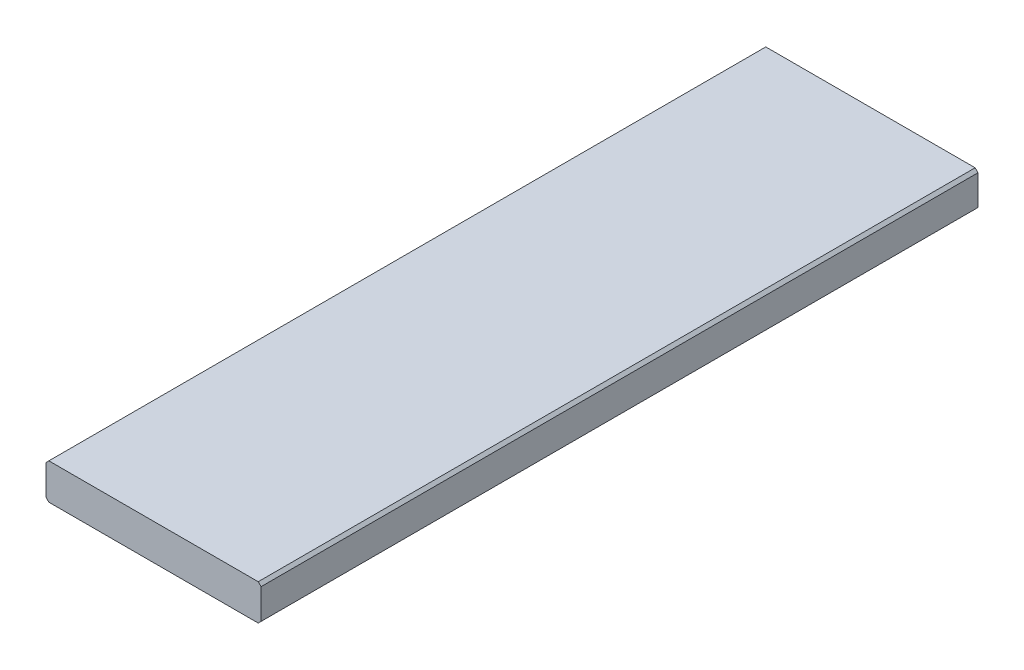
ISO-10303-21;
HEADER;
FILE_DESCRIPTION(('STEP AP214'),'2;1');
FILE_NAME('part.step','',(''),(''),'','','');
FILE_SCHEMA(('AUTOMOTIVE_DESIGN { 1 0 10303 214 1 1 1 1 }'));
ENDSEC;
DATA;
#1=APPLICATION_CONTEXT('core data for automotive mechanical design processes');
#2=APPLICATION_PROTOCOL_DEFINITION('international standard','automotive_design',2000,#1);
#3=PRODUCT_CONTEXT('',#1,'mechanical');
#4=PRODUCT('Part','Part','',(#3));
#5=PRODUCT_RELATED_PRODUCT_CATEGORY('part','',(#4));
#6=PRODUCT_DEFINITION_FORMATION('','',#4);
#7=PRODUCT_DEFINITION_CONTEXT('part definition',#1,'design');
#8=PRODUCT_DEFINITION('design','',#6,#7);
#9=PRODUCT_DEFINITION_SHAPE('','',#8);
#10=(LENGTH_UNIT() NAMED_UNIT(*) SI_UNIT(.MILLI.,.METRE.));
#11=(NAMED_UNIT(*) PLANE_ANGLE_UNIT() SI_UNIT($,.RADIAN.));
#12=(NAMED_UNIT(*) SI_UNIT($,.STERADIAN.) SOLID_ANGLE_UNIT());
#13=UNCERTAINTY_MEASURE_WITH_UNIT(LENGTH_MEASURE(1.E-05),#10,'distance_accuracy_value','');
#14=(GEOMETRIC_REPRESENTATION_CONTEXT(3) GLOBAL_UNCERTAINTY_ASSIGNED_CONTEXT((#13)) GLOBAL_UNIT_ASSIGNED_CONTEXT((#10,
#11,#12)) REPRESENTATION_CONTEXT('',''));
#15=CARTESIAN_POINT('',(0.,0.,0.));
#16=DIRECTION('',(0.,0.,1.));
#17=DIRECTION('',(1.,0.,0.));
#18=AXIS2_PLACEMENT_3D('',#15,#16,#17);
#19=CARTESIAN_POINT('',(-73.,12.5,500.));
#20=DIRECTION('',(0.,-1.,0.));
#21=DIRECTION('',(0.,0.,-1.));
#22=AXIS2_PLACEMENT_3D('',#19,#20,#21);
#23=PLANE('',#22);
#24=DIRECTION('',(-1.,0.,0.));
#25=VECTOR('',#24,1.);
#26=CARTESIAN_POINT('',(-73.,12.5,0.));
#27=LINE('',#26,#25);
#28=CARTESIAN_POINT('',(73.,12.5,0.));
#29=VERTEX_POINT('',#28);
#30=CARTESIAN_POINT('',(-73.,12.5,0.));
#31=VERTEX_POINT('',#30);
#32=EDGE_CURVE('E130',#29,#31,#27,.T.);
#33=ORIENTED_EDGE('',*,*,#32,.T.);
#34=DIRECTION('',(0.,0.,-1.));
#35=VECTOR('',#34,1.);
#36=CARTESIAN_POINT('',(-73.,12.5,500.));
#37=LINE('',#36,#35);
#38=CARTESIAN_POINT('',(-73.,12.5,500.));
#39=VERTEX_POINT('',#38);
#40=EDGE_CURVE('E11',#39,#31,#37,.T.);
#41=ORIENTED_EDGE('',*,*,#40,.F.);
#42=DIRECTION('',(-1.,0.,0.));
#43=VECTOR('',#42,1.);
#44=CARTESIAN_POINT('',(-73.,12.5,500.));
#45=LINE('',#44,#43);
#46=CARTESIAN_POINT('',(73.,12.5,500.));
#47=VERTEX_POINT('',#46);
#48=EDGE_CURVE('E144',#47,#39,#45,.T.);
#49=ORIENTED_EDGE('',*,*,#48,.F.);
#50=DIRECTION('',(0.,0.,-1.));
#51=VECTOR('',#50,1.);
#52=CARTESIAN_POINT('',(73.,12.5,500.));
#53=LINE('',#52,#51);
#54=EDGE_CURVE('E126',#47,#29,#53,.T.);
#55=ORIENTED_EDGE('',*,*,#54,.T.);
#56=EDGE_LOOP('',(#33,#41,#49,#55));
#57=FACE_BOUND('',#56,.T.);
#58=ADVANCED_FACE('F34',(#57),#23,.F.);
#59=CARTESIAN_POINT('',(-75.,10.5,500.));
#60=DIRECTION('',(0.707106781186547,-0.707106781186548,0.));
#61=DIRECTION('',(0.707106781186548,0.707106781186547,0.));
#62=AXIS2_PLACEMENT_3D('',#59,#60,#61);
#63=PLANE('',#62);
#64=DIRECTION('',(-0.707106781186548,-0.707106781186547,0.));
#65=VECTOR('',#64,1.);
#66=CARTESIAN_POINT('',(-75.,10.5,0.));
#67=LINE('',#66,#65);
#68=CARTESIAN_POINT('',(-75.,10.5,0.));
#69=VERTEX_POINT('',#68);
#70=EDGE_CURVE('E133',#31,#69,#67,.T.);
#71=ORIENTED_EDGE('',*,*,#70,.T.);
#72=DIRECTION('',(0.,0.,-1.));
#73=VECTOR('',#72,1.);
#74=CARTESIAN_POINT('',(-75.,10.5,500.));
#75=LINE('',#74,#73);
#76=CARTESIAN_POINT('',(-75.,10.5,500.));
#77=VERTEX_POINT('',#76);
#78=EDGE_CURVE('E42',#77,#69,#75,.T.);
#79=ORIENTED_EDGE('',*,*,#78,.F.);
#80=DIRECTION('',(-0.707106781186548,-0.707106781186547,0.));
#81=VECTOR('',#80,1.);
#82=CARTESIAN_POINT('',(-75.,10.5,500.));
#83=LINE('',#82,#81);
#84=EDGE_CURVE('E93',#39,#77,#83,.T.);
#85=ORIENTED_EDGE('',*,*,#84,.F.);
#86=ORIENTED_EDGE('',*,*,#40,.T.);
#87=EDGE_LOOP('',(#71,#79,#85,#86));
#88=FACE_BOUND('',#87,.T.);
#89=ADVANCED_FACE('F179',(#88),#63,.F.);
#90=CARTESIAN_POINT('',(-75.,10.5,500.));
#91=DIRECTION('',(1.,0.,0.));
#92=DIRECTION('',(0.,0.,-1.));
#93=AXIS2_PLACEMENT_3D('',#90,#91,#92);
#94=PLANE('',#93);
#95=DIRECTION('',(0.,-1.,0.));
#96=VECTOR('',#95,1.);
#97=CARTESIAN_POINT('',(-75.,10.5,0.));
#98=LINE('',#97,#96);
#99=CARTESIAN_POINT('',(-75.,-10.5,0.));
#100=VERTEX_POINT('',#99);
#101=EDGE_CURVE('E135',#69,#100,#98,.T.);
#102=ORIENTED_EDGE('',*,*,#101,.T.);
#103=DIRECTION('',(0.,0.,-1.));
#104=VECTOR('',#103,1.);
#105=CARTESIAN_POINT('',(-75.,-10.5,500.));
#106=LINE('',#105,#104);
#107=CARTESIAN_POINT('',(-75.,-10.5,500.));
#108=VERTEX_POINT('',#107);
#109=EDGE_CURVE('E151',#108,#100,#106,.T.);
#110=ORIENTED_EDGE('',*,*,#109,.F.);
#111=DIRECTION('',(0.,-1.,0.));
#112=VECTOR('',#111,1.);
#113=CARTESIAN_POINT('',(-75.,10.5,500.));
#114=LINE('',#113,#112);
#115=EDGE_CURVE('E159',#77,#108,#114,.T.);
#116=ORIENTED_EDGE('',*,*,#115,.F.);
#117=ORIENTED_EDGE('',*,*,#78,.T.);
#118=EDGE_LOOP('',(#102,#110,#116,#117));
#119=FACE_BOUND('',#118,.T.);
#120=ADVANCED_FACE('F157',(#119),#94,.F.);
#121=CARTESIAN_POINT('',(-75.,-10.5,500.));
#122=DIRECTION('',(0.707106781186547,0.707106781186548,0.));
#123=DIRECTION('',(-0.707106781186548,0.707106781186547,0.));
#124=AXIS2_PLACEMENT_3D('',#121,#122,#123);
#125=PLANE('',#124);
#126=DIRECTION('',(0.707106781186548,-0.707106781186547,0.));
#127=VECTOR('',#126,1.);
#128=CARTESIAN_POINT('',(-75.,-10.5,0.));
#129=LINE('',#128,#127);
#130=CARTESIAN_POINT('',(-73.,-12.5,0.));
#131=VERTEX_POINT('',#130);
#132=EDGE_CURVE('E137',#100,#131,#129,.T.);
#133=ORIENTED_EDGE('',*,*,#132,.T.);
#134=DIRECTION('',(0.,0.,-1.));
#135=VECTOR('',#134,1.);
#136=CARTESIAN_POINT('',(-73.,-12.5,500.));
#137=LINE('',#136,#135);
#138=CARTESIAN_POINT('',(-73.,-12.5,500.));
#139=VERTEX_POINT('',#138);
#140=EDGE_CURVE('E148',#139,#131,#137,.T.);
#141=ORIENTED_EDGE('',*,*,#140,.F.);
#142=DIRECTION('',(0.707106781186548,-0.707106781186547,0.));
#143=VECTOR('',#142,1.);
#144=CARTESIAN_POINT('',(-75.,-10.5,500.));
#145=LINE('',#144,#143);
#146=EDGE_CURVE('E171',#108,#139,#145,.T.);
#147=ORIENTED_EDGE('',*,*,#146,.F.);
#148=ORIENTED_EDGE('',*,*,#109,.T.);
#149=EDGE_LOOP('',(#133,#141,#147,#148));
#150=FACE_BOUND('',#149,.T.);
#151=ADVANCED_FACE('F167',(#150),#125,.F.);
#152=CARTESIAN_POINT('',(-73.,-12.5,500.));
#153=DIRECTION('',(0.,1.,0.));
#154=DIRECTION('',(0.,0.,1.));
#155=AXIS2_PLACEMENT_3D('',#152,#153,#154);
#156=PLANE('',#155);
#157=DIRECTION('',(1.,0.,0.));
#158=VECTOR('',#157,1.);
#159=CARTESIAN_POINT('',(-73.,-12.5,0.));
#160=LINE('',#159,#158);
#161=CARTESIAN_POINT('',(73.,-12.5,0.));
#162=VERTEX_POINT('',#161);
#163=EDGE_CURVE('E139',#131,#162,#160,.T.);
#164=ORIENTED_EDGE('',*,*,#163,.T.);
#165=DIRECTION('',(0.,0.,-1.));
#166=VECTOR('',#165,1.);
#167=CARTESIAN_POINT('',(73.,-12.5,500.));
#168=LINE('',#167,#166);
#169=CARTESIAN_POINT('',(73.,-12.5,500.));
#170=VERTEX_POINT('',#169);
#171=EDGE_CURVE('E121',#170,#162,#168,.T.);
#172=ORIENTED_EDGE('',*,*,#171,.F.);
#173=DIRECTION('',(1.,0.,0.));
#174=VECTOR('',#173,1.);
#175=CARTESIAN_POINT('',(-73.,-12.5,500.));
#176=LINE('',#175,#174);
#177=EDGE_CURVE('E112',#139,#170,#176,.T.);
#178=ORIENTED_EDGE('',*,*,#177,.F.);
#179=ORIENTED_EDGE('',*,*,#140,.T.);
#180=EDGE_LOOP('',(#164,#172,#178,#179));
#181=FACE_BOUND('',#180,.T.);
#182=ADVANCED_FACE('F170',(#181),#156,.F.);
#183=CARTESIAN_POINT('',(73.,-12.5,500.));
#184=DIRECTION('',(-0.707106781186547,0.707106781186548,0.));
#185=DIRECTION('',(-0.707106781186548,-0.707106781186547,0.));
#186=AXIS2_PLACEMENT_3D('',#183,#184,#185);
#187=PLANE('',#186);
#188=DIRECTION('',(0.707106781186548,0.707106781186547,0.));
#189=VECTOR('',#188,1.);
#190=CARTESIAN_POINT('',(73.,-12.5,0.));
#191=LINE('',#190,#189);
#192=CARTESIAN_POINT('',(75.,-10.5,0.));
#193=VERTEX_POINT('',#192);
#194=EDGE_CURVE('E120',#162,#193,#191,.T.);
#195=ORIENTED_EDGE('',*,*,#194,.T.);
#196=DIRECTION('',(0.,0.,-1.));
#197=VECTOR('',#196,1.);
#198=CARTESIAN_POINT('',(75.,-10.5,500.));
#199=LINE('',#198,#197);
#200=CARTESIAN_POINT('',(75.,-10.5,500.));
#201=VERTEX_POINT('',#200);
#202=EDGE_CURVE('E117',#201,#193,#199,.T.);
#203=ORIENTED_EDGE('',*,*,#202,.F.);
#204=DIRECTION('',(0.707106781186548,0.707106781186547,0.));
#205=VECTOR('',#204,1.);
#206=CARTESIAN_POINT('',(73.,-12.5,500.));
#207=LINE('',#206,#205);
#208=EDGE_CURVE('E106',#170,#201,#207,.T.);
#209=ORIENTED_EDGE('',*,*,#208,.F.);
#210=ORIENTED_EDGE('',*,*,#171,.T.);
#211=EDGE_LOOP('',(#195,#203,#209,#210));
#212=FACE_BOUND('',#211,.T.);
#213=ADVANCED_FACE('F118',(#212),#187,.F.);
#214=CARTESIAN_POINT('',(75.,10.5,500.));
#215=DIRECTION('',(-1.,0.,0.));
#216=DIRECTION('',(0.,0.,1.));
#217=AXIS2_PLACEMENT_3D('',#214,#215,#216);
#218=PLANE('',#217);
#219=DIRECTION('',(0.,1.,0.));
#220=VECTOR('',#219,1.);
#221=CARTESIAN_POINT('',(75.,10.5,0.));
#222=LINE('',#221,#220);
#223=CARTESIAN_POINT('',(75.,10.5,0.));
#224=VERTEX_POINT('',#223);
#225=EDGE_CURVE('E79',#193,#224,#222,.T.);
#226=ORIENTED_EDGE('',*,*,#225,.T.);
#227=DIRECTION('',(0.,0.,-1.));
#228=VECTOR('',#227,1.);
#229=CARTESIAN_POINT('',(75.,10.5,500.));
#230=LINE('',#229,#228);
#231=CARTESIAN_POINT('',(75.,10.5,500.));
#232=VERTEX_POINT('',#231);
#233=EDGE_CURVE('E122',#232,#224,#230,.T.);
#234=ORIENTED_EDGE('',*,*,#233,.F.);
#235=DIRECTION('',(0.,1.,0.));
#236=VECTOR('',#235,1.);
#237=CARTESIAN_POINT('',(75.,10.5,500.));
#238=LINE('',#237,#236);
#239=EDGE_CURVE('E110',#201,#232,#238,.T.);
#240=ORIENTED_EDGE('',*,*,#239,.F.);
#241=ORIENTED_EDGE('',*,*,#202,.T.);
#242=EDGE_LOOP('',(#226,#234,#240,#241));
#243=FACE_BOUND('',#242,.T.);
#244=ADVANCED_FACE('F124',(#243),#218,.F.);
#245=CARTESIAN_POINT('',(73.,12.5,500.));
#246=DIRECTION('',(-0.707106781186547,-0.707106781186548,0.));
#247=DIRECTION('',(0.707106781186548,-0.707106781186547,0.));
#248=AXIS2_PLACEMENT_3D('',#245,#246,#247);
#249=PLANE('',#248);
#250=DIRECTION('',(-0.707106781186548,0.707106781186547,0.));
#251=VECTOR('',#250,1.);
#252=CARTESIAN_POINT('',(73.,12.5,0.));
#253=LINE('',#252,#251);
#254=EDGE_CURVE('E85',#224,#29,#253,.T.);
#255=ORIENTED_EDGE('',*,*,#254,.T.);
#256=ORIENTED_EDGE('',*,*,#54,.F.);
#257=DIRECTION('',(-0.707106781186548,0.707106781186547,0.));
#258=VECTOR('',#257,1.);
#259=CARTESIAN_POINT('',(73.,12.5,500.));
#260=LINE('',#259,#258);
#261=EDGE_CURVE('E50',#232,#47,#260,.T.);
#262=ORIENTED_EDGE('',*,*,#261,.F.);
#263=ORIENTED_EDGE('',*,*,#233,.T.);
#264=EDGE_LOOP('',(#255,#256,#262,#263));
#265=FACE_BOUND('',#264,.T.);
#266=ADVANCED_FACE('F195',(#265),#249,.F.);
#267=CARTESIAN_POINT('',(0.,0.,500.));
#268=DIRECTION('',(0.,0.,-1.));
#269=DIRECTION('',(-1.,0.,0.));
#270=AXIS2_PLACEMENT_3D('',#267,#268,#269);
#271=PLANE('',#270);
#272=ORIENTED_EDGE('',*,*,#48,.T.);
#273=ORIENTED_EDGE('',*,*,#84,.T.);
#274=ORIENTED_EDGE('',*,*,#115,.T.);
#275=ORIENTED_EDGE('',*,*,#146,.T.);
#276=ORIENTED_EDGE('',*,*,#177,.T.);
#277=ORIENTED_EDGE('',*,*,#208,.T.);
#278=ORIENTED_EDGE('',*,*,#239,.T.);
#279=ORIENTED_EDGE('',*,*,#261,.T.);
#280=EDGE_LOOP('',(#272,#273,#274,#275,#276,#277,#278,#279));
#281=FACE_BOUND('',#280,.T.);
#282=ADVANCED_FACE('F108',(#281),#271,.F.);
#283=CARTESIAN_POINT('',(0.,0.,0.));
#284=DIRECTION('',(0.,0.,-1.));
#285=DIRECTION('',(-1.,0.,0.));
#286=AXIS2_PLACEMENT_3D('',#283,#284,#285);
#287=PLANE('',#286);
#288=ORIENTED_EDGE('',*,*,#32,.F.);
#289=ORIENTED_EDGE('',*,*,#254,.F.);
#290=ORIENTED_EDGE('',*,*,#225,.F.);
#291=ORIENTED_EDGE('',*,*,#194,.F.);
#292=ORIENTED_EDGE('',*,*,#163,.F.);
#293=ORIENTED_EDGE('',*,*,#132,.F.);
#294=ORIENTED_EDGE('',*,*,#101,.F.);
#295=ORIENTED_EDGE('',*,*,#70,.F.);
#296=EDGE_LOOP('',(#288,#289,#290,#291,#292,#293,#294,#295));
#297=FACE_BOUND('',#296,.T.);
#298=ADVANCED_FACE('F163',(#297),#287,.T.);
#299=CLOSED_SHELL('',(#58,#89,#120,#151,#182,#213,#244,#266,#282,#298));
#300=MANIFOLD_SOLID_BREP('B2',#299);
#301=ADVANCED_BREP_SHAPE_REPRESENTATION('',(#18,#300),#14);
#302=SHAPE_DEFINITION_REPRESENTATION(#9,#301);
ENDSEC;
END-ISO-10303-21;
